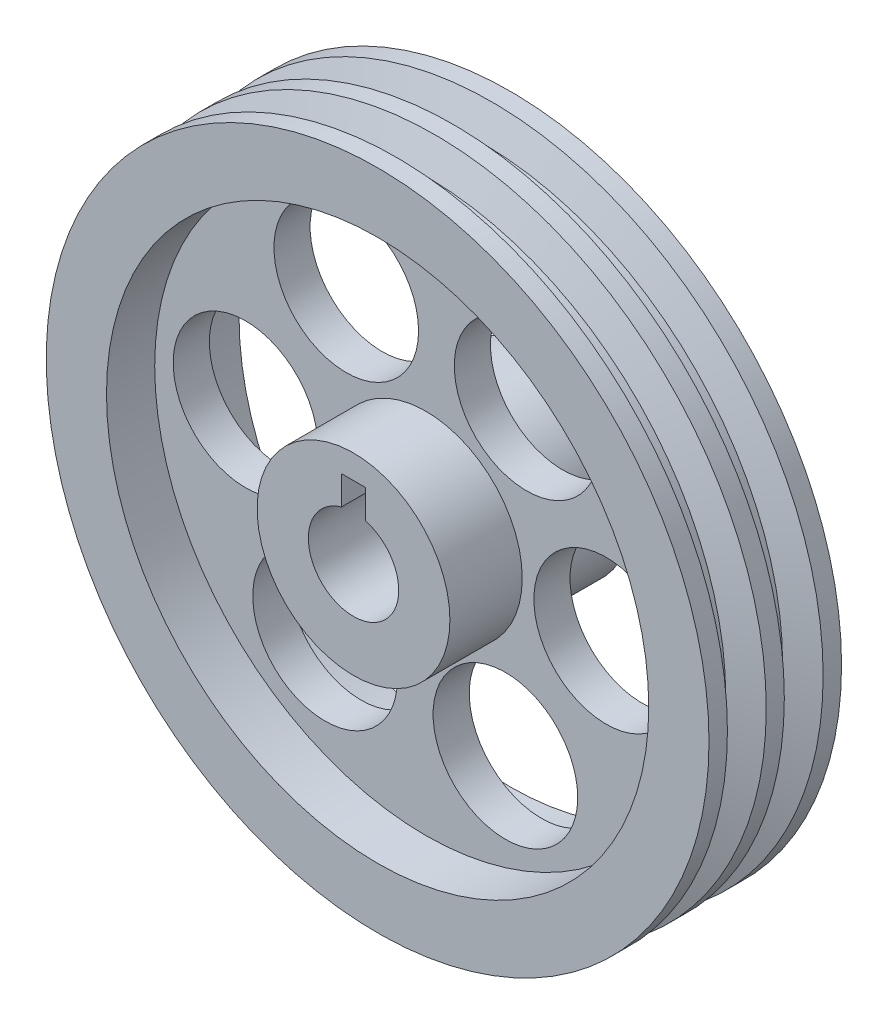
ISO-10303-21;
HEADER;
FILE_DESCRIPTION(('STEP AP214'),'2;1');
FILE_NAME('part.step','',(''),(''),'','','');
FILE_SCHEMA(('AUTOMOTIVE_DESIGN { 1 0 10303 214 1 1 1 1 }'));
ENDSEC;
DATA;
#1=APPLICATION_CONTEXT('core data for automotive mechanical design processes');
#2=APPLICATION_PROTOCOL_DEFINITION('international standard','automotive_design',2000,#1);
#3=PRODUCT_CONTEXT('',#1,'mechanical');
#4=PRODUCT('Part','Part','',(#3));
#5=PRODUCT_RELATED_PRODUCT_CATEGORY('part','',(#4));
#6=PRODUCT_DEFINITION_FORMATION('','',#4);
#7=PRODUCT_DEFINITION_CONTEXT('part definition',#1,'design');
#8=PRODUCT_DEFINITION('design','',#6,#7);
#9=PRODUCT_DEFINITION_SHAPE('','',#8);
#10=(LENGTH_UNIT() NAMED_UNIT(*) SI_UNIT(.MILLI.,.METRE.));
#11=(NAMED_UNIT(*) PLANE_ANGLE_UNIT() SI_UNIT($,.RADIAN.));
#12=(NAMED_UNIT(*) SI_UNIT($,.STERADIAN.) SOLID_ANGLE_UNIT());
#13=UNCERTAINTY_MEASURE_WITH_UNIT(LENGTH_MEASURE(1.E-05),#10,'distance_accuracy_value','');
#14=(GEOMETRIC_REPRESENTATION_CONTEXT(3) GLOBAL_UNCERTAINTY_ASSIGNED_CONTEXT((#13)) GLOBAL_UNIT_ASSIGNED_CONTEXT((#10,
#11,#12)) REPRESENTATION_CONTEXT('',''));
#15=CARTESIAN_POINT('',(0.,0.,0.));
#16=DIRECTION('',(0.,0.,1.));
#17=DIRECTION('',(1.,0.,0.));
#18=AXIS2_PLACEMENT_3D('',#15,#16,#17);
#19=CARTESIAN_POINT('',(0.,0.,11.));
#20=DIRECTION('',(0.,0.,-1.));
#21=DIRECTION('',(-1.,0.,0.));
#22=AXIS2_PLACEMENT_3D('',#19,#20,#21);
#23=CYLINDRICAL_SURFACE('',#22,55.);
#24=CARTESIAN_POINT('',(0.,0.,11.));
#25=DIRECTION('',(0.,0.,1.));
#26=DIRECTION('',(1.,0.,0.));
#27=AXIS2_PLACEMENT_3D('',#24,#25,#26);
#28=CIRCLE('',#27,55.);
#29=CARTESIAN_POINT('',(55.,0.,11.));
#30=VERTEX_POINT('',#29);
#31=EDGE_CURVE('E178',#30,#30,#28,.T.);
#32=ORIENTED_EDGE('',*,*,#31,.F.);
#33=EDGE_LOOP('',(#32));
#34=FACE_BOUND('',#33,.T.);
#35=CARTESIAN_POINT('',(0.,0.,7.94327613289666));
#36=DIRECTION('',(0.,0.,1.));
#37=DIRECTION('',(1.,0.,0.));
#38=AXIS2_PLACEMENT_3D('',#35,#36,#37);
#39=CIRCLE('',#38,55.);
#40=CARTESIAN_POINT('',(55.,0.,7.94327613289666));
#41=VERTEX_POINT('',#40);
#42=EDGE_CURVE('E186',#41,#41,#39,.T.);
#43=ORIENTED_EDGE('',*,*,#42,.T.);
#44=EDGE_LOOP('',(#43));
#45=FACE_BOUND('',#44,.T.);
#46=ADVANCED_FACE('F45',(#34,#45),#23,.T.);
#47=CARTESIAN_POINT('',(0.,0.,15.));
#48=DIRECTION('',(0.,0.,-1.));
#49=DIRECTION('',(-1.,0.,0.));
#50=AXIS2_PLACEMENT_3D('',#47,#48,#49);
#51=CYLINDRICAL_SURFACE('',#50,16.);
#52=CARTESIAN_POINT('',(0.,0.,-15.));
#53=DIRECTION('',(0.,0.,1.));
#54=DIRECTION('',(1.,0.,0.));
#55=AXIS2_PLACEMENT_3D('',#52,#53,#54);
#56=CIRCLE('',#55,16.);
#57=CARTESIAN_POINT('',(16.,0.,-15.));
#58=VERTEX_POINT('',#57);
#59=EDGE_CURVE('E125',#58,#58,#56,.T.);
#60=ORIENTED_EDGE('',*,*,#59,.T.);
#61=EDGE_LOOP('',(#60));
#62=FACE_BOUND('',#61,.T.);
#63=CARTESIAN_POINT('',(0.,0.,-3.));
#64=DIRECTION('',(0.,0.,1.));
#65=DIRECTION('',(1.,0.,0.));
#66=AXIS2_PLACEMENT_3D('',#63,#64,#65);
#67=CIRCLE('',#66,16.);
#68=CARTESIAN_POINT('',(16.,0.,-3.));
#69=VERTEX_POINT('',#68);
#70=EDGE_CURVE('E11',#69,#69,#67,.T.);
#71=ORIENTED_EDGE('',*,*,#70,.F.);
#72=EDGE_LOOP('',(#71));
#73=FACE_BOUND('',#72,.T.);
#74=ADVANCED_FACE('F244',(#62,#73),#51,.T.);
#75=CARTESIAN_POINT('',(0.,0.,15.));
#76=DIRECTION('',(0.,0.,-1.));
#77=DIRECTION('',(-1.,0.,0.));
#78=AXIS2_PLACEMENT_3D('',#75,#76,#77);
#79=CYLINDRICAL_SURFACE('',#78,7.5);
#80=CARTESIAN_POINT('',(0.,0.,-15.));
#81=DIRECTION('',(0.,0.,1.));
#82=DIRECTION('',(1.,0.,0.));
#83=AXIS2_PLACEMENT_3D('',#80,#81,#82);
#84=CIRCLE('',#83,7.5);
#85=CARTESIAN_POINT('',(-2.,7.22841614740048,-15.));
#86=VERTEX_POINT('',#85);
#87=CARTESIAN_POINT('',(2.,7.22841614740048,-15.));
#88=VERTEX_POINT('',#87);
#89=EDGE_CURVE('E116',#86,#88,#84,.T.);
#90=ORIENTED_EDGE('',*,*,#89,.F.);
#91=DIRECTION('',(0.,0.,-1.));
#92=VECTOR('',#91,1.);
#93=CARTESIAN_POINT('',(-2.,7.22841614740048,15.));
#94=LINE('',#93,#92);
#95=CARTESIAN_POINT('',(-2.,7.22841614740048,15.));
#96=VERTEX_POINT('',#95);
#97=EDGE_CURVE('E54',#96,#86,#94,.T.);
#98=ORIENTED_EDGE('',*,*,#97,.F.);
#99=CARTESIAN_POINT('',(0.,0.,15.));
#100=DIRECTION('',(0.,0.,1.));
#101=DIRECTION('',(1.,0.,0.));
#102=AXIS2_PLACEMENT_3D('',#99,#100,#101);
#103=CIRCLE('',#102,7.5);
#104=CARTESIAN_POINT('',(2.,7.22841614740048,15.));
#105=VERTEX_POINT('',#104);
#106=EDGE_CURVE('E106',#96,#105,#103,.T.);
#107=ORIENTED_EDGE('',*,*,#106,.T.);
#108=DIRECTION('',(0.,0.,-1.));
#109=VECTOR('',#108,1.);
#110=CARTESIAN_POINT('',(2.,7.22841614740048,15.));
#111=LINE('',#110,#109);
#112=EDGE_CURVE('E85',#105,#88,#111,.T.);
#113=ORIENTED_EDGE('',*,*,#112,.T.);
#114=EDGE_LOOP('',(#90,#98,#107,#113));
#115=FACE_BOUND('',#114,.T.);
#116=ADVANCED_FACE('F47',(#115),#79,.F.);
#117=CARTESIAN_POINT('',(-2.,0.,15.));
#118=DIRECTION('',(1.,0.,0.));
#119=DIRECTION('',(0.,0.,-1.));
#120=AXIS2_PLACEMENT_3D('',#117,#118,#119);
#121=PLANE('',#120);
#122=DIRECTION('',(0.,-1.,0.));
#123=VECTOR('',#122,1.);
#124=CARTESIAN_POINT('',(-2.,0.,-15.));
#125=LINE('',#124,#123);
#126=CARTESIAN_POINT('',(-2.,12.0229167109817,-15.));
#127=VERTEX_POINT('',#126);
#128=EDGE_CURVE('E97',#127,#86,#125,.T.);
#129=ORIENTED_EDGE('',*,*,#128,.F.);
#130=DIRECTION('',(0.,0.,-1.));
#131=VECTOR('',#130,1.);
#132=CARTESIAN_POINT('',(-2.,12.0229167109817,15.));
#133=LINE('',#132,#131);
#134=CARTESIAN_POINT('',(-2.,12.0229167109817,15.));
#135=VERTEX_POINT('',#134);
#136=EDGE_CURVE('E92',#135,#127,#133,.T.);
#137=ORIENTED_EDGE('',*,*,#136,.F.);
#138=DIRECTION('',(0.,-1.,0.));
#139=VECTOR('',#138,1.);
#140=CARTESIAN_POINT('',(-2.,0.,15.));
#141=LINE('',#140,#139);
#142=EDGE_CURVE('E95',#135,#96,#141,.T.);
#143=ORIENTED_EDGE('',*,*,#142,.T.);
#144=ORIENTED_EDGE('',*,*,#97,.T.);
#145=EDGE_LOOP('',(#129,#137,#143,#144));
#146=FACE_BOUND('',#145,.T.);
#147=ADVANCED_FACE('F94',(#146),#121,.T.);
#148=CARTESIAN_POINT('',(0.,12.0229167109817,15.));
#149=DIRECTION('',(0.,-1.,0.));
#150=DIRECTION('',(0.,0.,-1.));
#151=AXIS2_PLACEMENT_3D('',#148,#149,#150);
#152=PLANE('',#151);
#153=DIRECTION('',(-1.,0.,0.));
#154=VECTOR('',#153,1.);
#155=CARTESIAN_POINT('',(0.,12.0229167109817,-15.));
#156=LINE('',#155,#154);
#157=CARTESIAN_POINT('',(2.,12.0229167109817,-15.));
#158=VERTEX_POINT('',#157);
#159=EDGE_CURVE('E121',#158,#127,#156,.T.);
#160=ORIENTED_EDGE('',*,*,#159,.F.);
#161=DIRECTION('',(0.,0.,-1.));
#162=VECTOR('',#161,1.);
#163=CARTESIAN_POINT('',(2.,12.0229167109817,15.));
#164=LINE('',#163,#162);
#165=CARTESIAN_POINT('',(2.,12.0229167109817,15.));
#166=VERTEX_POINT('',#165);
#167=EDGE_CURVE('E78',#166,#158,#164,.T.);
#168=ORIENTED_EDGE('',*,*,#167,.F.);
#169=DIRECTION('',(-1.,0.,0.));
#170=VECTOR('',#169,1.);
#171=CARTESIAN_POINT('',(0.,12.0229167109817,15.));
#172=LINE('',#171,#170);
#173=EDGE_CURVE('E105',#166,#135,#172,.T.);
#174=ORIENTED_EDGE('',*,*,#173,.T.);
#175=ORIENTED_EDGE('',*,*,#136,.T.);
#176=EDGE_LOOP('',(#160,#168,#174,#175));
#177=FACE_BOUND('',#176,.T.);
#178=ADVANCED_FACE('F108',(#177),#152,.T.);
#179=CARTESIAN_POINT('',(2.,0.,15.));
#180=DIRECTION('',(1.,0.,0.));
#181=DIRECTION('',(0.,0.,-1.));
#182=AXIS2_PLACEMENT_3D('',#179,#180,#181);
#183=PLANE('',#182);
#184=DIRECTION('',(0.,-1.,0.));
#185=VECTOR('',#184,1.);
#186=CARTESIAN_POINT('',(2.,0.,-15.));
#187=LINE('',#186,#185);
#188=EDGE_CURVE('E123',#158,#88,#187,.T.);
#189=ORIENTED_EDGE('',*,*,#188,.T.);
#190=ORIENTED_EDGE('',*,*,#112,.F.);
#191=DIRECTION('',(0.,-1.,0.));
#192=VECTOR('',#191,1.);
#193=CARTESIAN_POINT('',(2.,0.,15.));
#194=LINE('',#193,#192);
#195=EDGE_CURVE('E62',#166,#105,#194,.T.);
#196=ORIENTED_EDGE('',*,*,#195,.F.);
#197=ORIENTED_EDGE('',*,*,#167,.T.);
#198=EDGE_LOOP('',(#189,#190,#196,#197));
#199=FACE_BOUND('',#198,.T.);
#200=ADVANCED_FACE('F132',(#199),#183,.F.);
#201=CARTESIAN_POINT('',(0.,0.,3.));
#202=DIRECTION('',(0.,0.,1.));
#203=DIRECTION('',(1.,0.,0.));
#204=AXIS2_PLACEMENT_3D('',#201,#202,#203);
#205=CIRCLE('',#204,16.);
#206=CARTESIAN_POINT('',(16.,0.,3.));
#207=VERTEX_POINT('',#206);
#208=EDGE_CURVE('E137',#207,#207,#205,.T.);
#209=ORIENTED_EDGE('',*,*,#208,.T.);
#210=EDGE_LOOP('',(#209));
#211=FACE_BOUND('',#210,.T.);
#212=CARTESIAN_POINT('',(0.,0.,15.));
#213=DIRECTION('',(0.,0.,1.));
#214=DIRECTION('',(1.,0.,0.));
#215=AXIS2_PLACEMENT_3D('',#212,#213,#214);
#216=CIRCLE('',#215,16.);
#217=CARTESIAN_POINT('',(16.,0.,15.));
#218=VERTEX_POINT('',#217);
#219=EDGE_CURVE('E110',#218,#218,#216,.T.);
#220=ORIENTED_EDGE('',*,*,#219,.F.);
#221=EDGE_LOOP('',(#220));
#222=FACE_BOUND('',#221,.T.);
#223=ADVANCED_FACE('F251',(#211,#222),#51,.T.);
#224=CARTESIAN_POINT('',(0.,0.,15.));
#225=DIRECTION('',(0.,0.,1.));
#226=DIRECTION('',(1.,0.,0.));
#227=AXIS2_PLACEMENT_3D('',#224,#225,#226);
#228=PLANE('',#227);
#229=ORIENTED_EDGE('',*,*,#106,.F.);
#230=ORIENTED_EDGE('',*,*,#142,.F.);
#231=ORIENTED_EDGE('',*,*,#173,.F.);
#232=ORIENTED_EDGE('',*,*,#195,.T.);
#233=EDGE_LOOP('',(#229,#230,#231,#232));
#234=FACE_BOUND('',#233,.T.);
#235=ORIENTED_EDGE('',*,*,#219,.T.);
#236=EDGE_LOOP('',(#235));
#237=FACE_BOUND('',#236,.T.);
#238=ADVANCED_FACE('F103',(#234,#237),#228,.T.);
#239=CARTESIAN_POINT('',(0.,0.,-15.));
#240=DIRECTION('',(0.,0.,1.));
#241=DIRECTION('',(1.,0.,0.));
#242=AXIS2_PLACEMENT_3D('',#239,#240,#241);
#243=PLANE('',#242);
#244=ORIENTED_EDGE('',*,*,#89,.T.);
#245=ORIENTED_EDGE('',*,*,#188,.F.);
#246=ORIENTED_EDGE('',*,*,#159,.T.);
#247=ORIENTED_EDGE('',*,*,#128,.T.);
#248=EDGE_LOOP('',(#244,#245,#246,#247));
#249=FACE_BOUND('',#248,.T.);
#250=ORIENTED_EDGE('',*,*,#59,.F.);
#251=EDGE_LOOP('',(#250));
#252=FACE_BOUND('',#251,.T.);
#253=ADVANCED_FACE('F130',(#249,#252),#243,.F.);
#254=CARTESIAN_POINT('',(-13.2074533591109,26.9362799169988,3.));
#255=DIRECTION('',(0.,0.,-1.));
#256=DIRECTION('',(-1.,0.,0.));
#257=AXIS2_PLACEMENT_3D('',#254,#255,#256);
#258=CYLINDRICAL_SURFACE('',#257,12.);
#259=CARTESIAN_POINT('',(-13.2074533591109,26.9362799169988,3.));
#260=DIRECTION('',(0.,0.,1.));
#261=DIRECTION('',(1.,0.,0.));
#262=AXIS2_PLACEMENT_3D('',#259,#260,#261);
#263=CIRCLE('',#262,12.);
#264=CARTESIAN_POINT('',(-1.20745335911087,26.9362799169988,3.));
#265=VERTEX_POINT('',#264);
#266=EDGE_CURVE('E119',#265,#265,#263,.T.);
#267=ORIENTED_EDGE('',*,*,#266,.T.);
#268=EDGE_LOOP('',(#267));
#269=FACE_BOUND('',#268,.T.);
#270=CARTESIAN_POINT('',(-13.2074533591109,26.9362799169988,-3.));
#271=DIRECTION('',(0.,0.,1.));
#272=DIRECTION('',(1.,0.,0.));
#273=AXIS2_PLACEMENT_3D('',#270,#271,#272);
#274=CIRCLE('',#273,12.);
#275=CARTESIAN_POINT('',(-1.20745335911087,26.9362799169988,-3.));
#276=VERTEX_POINT('',#275);
#277=EDGE_CURVE('E138',#276,#276,#274,.T.);
#278=ORIENTED_EDGE('',*,*,#277,.F.);
#279=EDGE_LOOP('',(#278));
#280=FACE_BOUND('',#279,.T.);
#281=ADVANCED_FACE('F429',(#269,#280),#258,.F.);
#282=CARTESIAN_POINT('',(-29.931229371125,2.03014983021119,3.));
#283=DIRECTION('',(0.,0.,-1.));
#284=DIRECTION('',(-1.,0.,0.));
#285=AXIS2_PLACEMENT_3D('',#282,#283,#284);
#286=CYLINDRICAL_SURFACE('',#285,12.);
#287=CARTESIAN_POINT('',(-29.931229371125,2.03014983021119,3.));
#288=DIRECTION('',(0.,0.,1.));
#289=DIRECTION('',(1.,0.,0.));
#290=AXIS2_PLACEMENT_3D('',#287,#288,#289);
#291=CIRCLE('',#290,12.);
#292=CARTESIAN_POINT('',(-17.9312293711249,2.03014983021119,3.));
#293=VERTEX_POINT('',#292);
#294=EDGE_CURVE('E159',#293,#293,#291,.T.);
#295=ORIENTED_EDGE('',*,*,#294,.T.);
#296=EDGE_LOOP('',(#295));
#297=FACE_BOUND('',#296,.T.);
#298=CARTESIAN_POINT('',(-29.931229371125,2.03014983021119,-3.));
#299=DIRECTION('',(0.,0.,1.));
#300=DIRECTION('',(1.,0.,0.));
#301=AXIS2_PLACEMENT_3D('',#298,#299,#300);
#302=CIRCLE('',#301,12.);
#303=CARTESIAN_POINT('',(-17.9312293711249,2.03014983021119,-3.));
#304=VERTEX_POINT('',#303);
#305=EDGE_CURVE('E141',#304,#304,#302,.T.);
#306=ORIENTED_EDGE('',*,*,#305,.F.);
#307=EDGE_LOOP('',(#306));
#308=FACE_BOUND('',#307,.T.);
#309=ADVANCED_FACE('F419',(#297,#308),#286,.F.);
#310=CARTESIAN_POINT('',(-16.723776012014,-24.9061300867876,3.));
#311=DIRECTION('',(0.,0.,-1.));
#312=DIRECTION('',(-1.,0.,0.));
#313=AXIS2_PLACEMENT_3D('',#310,#311,#312);
#314=CYLINDRICAL_SURFACE('',#313,12.);
#315=CARTESIAN_POINT('',(-16.723776012014,-24.9061300867876,3.));
#316=DIRECTION('',(0.,0.,1.));
#317=DIRECTION('',(1.,0.,0.));
#318=AXIS2_PLACEMENT_3D('',#315,#316,#317);
#319=CIRCLE('',#318,12.);
#320=CARTESIAN_POINT('',(-4.72377601201397,-24.9061300867876,3.));
#321=VERTEX_POINT('',#320);
#322=EDGE_CURVE('E162',#321,#321,#319,.T.);
#323=ORIENTED_EDGE('',*,*,#322,.T.);
#324=EDGE_LOOP('',(#323));
#325=FACE_BOUND('',#324,.T.);
#326=CARTESIAN_POINT('',(-16.723776012014,-24.9061300867876,-3.));
#327=DIRECTION('',(0.,0.,1.));
#328=DIRECTION('',(1.,0.,0.));
#329=AXIS2_PLACEMENT_3D('',#326,#327,#328);
#330=CIRCLE('',#329,12.);
#331=CARTESIAN_POINT('',(-4.72377601201397,-24.9061300867876,-3.));
#332=VERTEX_POINT('',#331);
#333=EDGE_CURVE('E144',#332,#332,#330,.T.);
#334=ORIENTED_EDGE('',*,*,#333,.F.);
#335=EDGE_LOOP('',(#334));
#336=FACE_BOUND('',#335,.T.);
#337=ADVANCED_FACE('F409',(#325,#336),#314,.F.);
#338=CARTESIAN_POINT('',(13.2074533591111,-26.9362799169987,3.));
#339=DIRECTION('',(0.,0.,-1.));
#340=DIRECTION('',(-1.,0.,0.));
#341=AXIS2_PLACEMENT_3D('',#338,#339,#340);
#342=CYLINDRICAL_SURFACE('',#341,12.);
#343=CARTESIAN_POINT('',(13.2074533591111,-26.9362799169987,3.));
#344=DIRECTION('',(0.,0.,1.));
#345=DIRECTION('',(1.,0.,0.));
#346=AXIS2_PLACEMENT_3D('',#343,#344,#345);
#347=CIRCLE('',#346,12.);
#348=CARTESIAN_POINT('',(25.2074533591111,-26.9362799169987,3.));
#349=VERTEX_POINT('',#348);
#350=EDGE_CURVE('E165',#349,#349,#347,.T.);
#351=ORIENTED_EDGE('',*,*,#350,.T.);
#352=EDGE_LOOP('',(#351));
#353=FACE_BOUND('',#352,.T.);
#354=CARTESIAN_POINT('',(13.2074533591111,-26.9362799169987,-3.));
#355=DIRECTION('',(0.,0.,1.));
#356=DIRECTION('',(1.,0.,0.));
#357=AXIS2_PLACEMENT_3D('',#354,#355,#356);
#358=CIRCLE('',#357,12.);
#359=CARTESIAN_POINT('',(25.2074533591111,-26.9362799169987,-3.));
#360=VERTEX_POINT('',#359);
#361=EDGE_CURVE('E147',#360,#360,#358,.T.);
#362=ORIENTED_EDGE('',*,*,#361,.F.);
#363=EDGE_LOOP('',(#362));
#364=FACE_BOUND('',#363,.T.);
#365=ADVANCED_FACE('F399',(#353,#364),#342,.F.);
#366=CARTESIAN_POINT('',(29.931229371125,-2.03014983021098,3.));
#367=DIRECTION('',(0.,0.,-1.));
#368=DIRECTION('',(-1.,0.,0.));
#369=AXIS2_PLACEMENT_3D('',#366,#367,#368);
#370=CYLINDRICAL_SURFACE('',#369,12.);
#371=CARTESIAN_POINT('',(29.931229371125,-2.03014983021098,3.));
#372=DIRECTION('',(0.,0.,1.));
#373=DIRECTION('',(1.,0.,0.));
#374=AXIS2_PLACEMENT_3D('',#371,#372,#373);
#375=CIRCLE('',#374,12.);
#376=CARTESIAN_POINT('',(41.931229371125,-2.03014983021098,3.));
#377=VERTEX_POINT('',#376);
#378=EDGE_CURVE('E168',#377,#377,#375,.T.);
#379=ORIENTED_EDGE('',*,*,#378,.T.);
#380=EDGE_LOOP('',(#379));
#381=FACE_BOUND('',#380,.T.);
#382=CARTESIAN_POINT('',(29.931229371125,-2.03014983021098,-3.));
#383=DIRECTION('',(0.,0.,1.));
#384=DIRECTION('',(1.,0.,0.));
#385=AXIS2_PLACEMENT_3D('',#382,#383,#384);
#386=CIRCLE('',#385,12.);
#387=CARTESIAN_POINT('',(41.931229371125,-2.03014983021098,-3.));
#388=VERTEX_POINT('',#387);
#389=EDGE_CURVE('E150',#388,#388,#386,.T.);
#390=ORIENTED_EDGE('',*,*,#389,.F.);
#391=EDGE_LOOP('',(#390));
#392=FACE_BOUND('',#391,.T.);
#393=ADVANCED_FACE('F389',(#381,#392),#370,.F.);
#394=CARTESIAN_POINT('',(16.7237760120138,24.9061300867877,3.));
#395=DIRECTION('',(0.,0.,-1.));
#396=DIRECTION('',(-1.,0.,0.));
#397=AXIS2_PLACEMENT_3D('',#394,#395,#396);
#398=CYLINDRICAL_SURFACE('',#397,12.);
#399=CARTESIAN_POINT('',(16.7237760120138,24.9061300867877,3.));
#400=DIRECTION('',(0.,0.,1.));
#401=DIRECTION('',(1.,0.,0.));
#402=AXIS2_PLACEMENT_3D('',#399,#400,#401);
#403=CIRCLE('',#402,12.);
#404=CARTESIAN_POINT('',(28.7237760120138,24.9061300867877,3.));
#405=VERTEX_POINT('',#404);
#406=EDGE_CURVE('E171',#405,#405,#403,.T.);
#407=ORIENTED_EDGE('',*,*,#406,.T.);
#408=EDGE_LOOP('',(#407));
#409=FACE_BOUND('',#408,.T.);
#410=CARTESIAN_POINT('',(16.7237760120138,24.9061300867877,-3.));
#411=DIRECTION('',(0.,0.,1.));
#412=DIRECTION('',(1.,0.,0.));
#413=AXIS2_PLACEMENT_3D('',#410,#411,#412);
#414=CIRCLE('',#413,12.);
#415=CARTESIAN_POINT('',(28.7237760120138,24.9061300867877,-3.));
#416=VERTEX_POINT('',#415);
#417=EDGE_CURVE('E153',#416,#416,#414,.T.);
#418=ORIENTED_EDGE('',*,*,#417,.F.);
#419=EDGE_LOOP('',(#418));
#420=FACE_BOUND('',#419,.T.);
#421=ADVANCED_FACE('F379',(#409,#420),#398,.F.);
#422=CARTESIAN_POINT('',(0.,0.,3.));
#423=DIRECTION('',(0.,0.,1.));
#424=DIRECTION('',(1.,0.,0.));
#425=AXIS2_PLACEMENT_3D('',#422,#423,#424);
#426=PLANE('',#425);
#427=ORIENTED_EDGE('',*,*,#208,.F.);
#428=EDGE_LOOP('',(#427));
#429=FACE_BOUND('',#428,.T.);
#430=ORIENTED_EDGE('',*,*,#406,.F.);
#431=EDGE_LOOP('',(#430));
#432=FACE_BOUND('',#431,.T.);
#433=ORIENTED_EDGE('',*,*,#378,.F.);
#434=EDGE_LOOP('',(#433));
#435=FACE_BOUND('',#434,.T.);
#436=ORIENTED_EDGE('',*,*,#350,.F.);
#437=EDGE_LOOP('',(#436));
#438=FACE_BOUND('',#437,.T.);
#439=ORIENTED_EDGE('',*,*,#322,.F.);
#440=EDGE_LOOP('',(#439));
#441=FACE_BOUND('',#440,.T.);
#442=ORIENTED_EDGE('',*,*,#294,.F.);
#443=EDGE_LOOP('',(#442));
#444=FACE_BOUND('',#443,.T.);
#445=ORIENTED_EDGE('',*,*,#266,.F.);
#446=EDGE_LOOP('',(#445));
#447=FACE_BOUND('',#446,.T.);
#448=CARTESIAN_POINT('',(0.,0.,3.));
#449=DIRECTION('',(0.,0.,1.));
#450=DIRECTION('',(1.,0.,0.));
#451=AXIS2_PLACEMENT_3D('',#448,#449,#450);
#452=CIRCLE('',#451,45.);
#453=CARTESIAN_POINT('',(45.,0.,3.));
#454=VERTEX_POINT('',#453);
#455=EDGE_CURVE('E156',#454,#454,#452,.F.);
#456=ORIENTED_EDGE('',*,*,#455,.F.);
#457=EDGE_LOOP('',(#456));
#458=FACE_BOUND('',#457,.T.);
#459=ADVANCED_FACE('F369',(#429,#432,#435,#438,#441,#444,#447,#458),#426,.T.);
#460=CARTESIAN_POINT('',(0.,0.,-3.));
#461=DIRECTION('',(0.,0.,1.));
#462=DIRECTION('',(1.,0.,0.));
#463=AXIS2_PLACEMENT_3D('',#460,#461,#462);
#464=PLANE('',#463);
#465=ORIENTED_EDGE('',*,*,#70,.T.);
#466=EDGE_LOOP('',(#465));
#467=FACE_BOUND('',#466,.T.);
#468=ORIENTED_EDGE('',*,*,#417,.T.);
#469=EDGE_LOOP('',(#468));
#470=FACE_BOUND('',#469,.T.);
#471=ORIENTED_EDGE('',*,*,#389,.T.);
#472=EDGE_LOOP('',(#471));
#473=FACE_BOUND('',#472,.T.);
#474=ORIENTED_EDGE('',*,*,#361,.T.);
#475=EDGE_LOOP('',(#474));
#476=FACE_BOUND('',#475,.T.);
#477=ORIENTED_EDGE('',*,*,#333,.T.);
#478=EDGE_LOOP('',(#477));
#479=FACE_BOUND('',#478,.T.);
#480=ORIENTED_EDGE('',*,*,#305,.T.);
#481=EDGE_LOOP('',(#480));
#482=FACE_BOUND('',#481,.T.);
#483=ORIENTED_EDGE('',*,*,#277,.T.);
#484=EDGE_LOOP('',(#483));
#485=FACE_BOUND('',#484,.T.);
#486=CARTESIAN_POINT('',(0.,0.,-3.));
#487=DIRECTION('',(0.,0.,1.));
#488=DIRECTION('',(1.,0.,0.));
#489=AXIS2_PLACEMENT_3D('',#486,#487,#488);
#490=CIRCLE('',#489,45.);
#491=CARTESIAN_POINT('',(45.,0.,-3.));
#492=VERTEX_POINT('',#491);
#493=EDGE_CURVE('E134',#492,#492,#490,.T.);
#494=ORIENTED_EDGE('',*,*,#493,.F.);
#495=EDGE_LOOP('',(#494));
#496=FACE_BOUND('',#495,.T.);
#497=ADVANCED_FACE('F360',(#467,#470,#473,#476,#479,#482,#485,#496),#464,.F.);
#498=CARTESIAN_POINT('',(0.,0.,11.));
#499=DIRECTION('',(0.,0.,-1.));
#500=DIRECTION('',(-1.,0.,0.));
#501=AXIS2_PLACEMENT_3D('',#498,#499,#500);
#502=CYLINDRICAL_SURFACE('',#501,45.);
#503=CARTESIAN_POINT('',(0.,0.,-11.));
#504=DIRECTION('',(0.,0.,1.));
#505=DIRECTION('',(1.,0.,0.));
#506=AXIS2_PLACEMENT_3D('',#503,#504,#505);
#507=CIRCLE('',#506,45.);
#508=CARTESIAN_POINT('',(45.,0.,-11.));
#509=VERTEX_POINT('',#508);
#510=EDGE_CURVE('E183',#509,#509,#507,.T.);
#511=ORIENTED_EDGE('',*,*,#510,.F.);
#512=EDGE_LOOP('',(#511));
#513=FACE_BOUND('',#512,.T.);
#514=ORIENTED_EDGE('',*,*,#493,.T.);
#515=EDGE_LOOP('',(#514));
#516=FACE_BOUND('',#515,.T.);
#517=ADVANCED_FACE('F262',(#513,#516),#502,.F.);
#518=ORIENTED_EDGE('',*,*,#455,.T.);
#519=EDGE_LOOP('',(#518));
#520=FACE_BOUND('',#519,.T.);
#521=CARTESIAN_POINT('',(0.,0.,11.));
#522=DIRECTION('',(0.,0.,1.));
#523=DIRECTION('',(1.,0.,0.));
#524=AXIS2_PLACEMENT_3D('',#521,#522,#523);
#525=CIRCLE('',#524,45.);
#526=CARTESIAN_POINT('',(45.,0.,11.));
#527=VERTEX_POINT('',#526);
#528=EDGE_CURVE('E182',#527,#527,#525,.T.);
#529=ORIENTED_EDGE('',*,*,#528,.T.);
#530=EDGE_LOOP('',(#529));
#531=FACE_BOUND('',#530,.T.);
#532=ADVANCED_FACE('F255',(#520,#531),#502,.F.);
#533=CARTESIAN_POINT('',(0.,0.,-7.94327613289666));
#534=DIRECTION('',(0.,0.,1.));
#535=DIRECTION('',(1.,0.,0.));
#536=AXIS2_PLACEMENT_3D('',#533,#534,#535);
#537=CIRCLE('',#536,55.);
#538=CARTESIAN_POINT('',(55.,0.,-7.94327613289666));
#539=VERTEX_POINT('',#538);
#540=EDGE_CURVE('E201',#539,#539,#537,.T.);
#541=ORIENTED_EDGE('',*,*,#540,.F.);
#542=EDGE_LOOP('',(#541));
#543=FACE_BOUND('',#542,.T.);
#544=CARTESIAN_POINT('',(0.,0.,-11.));
#545=DIRECTION('',(0.,0.,1.));
#546=DIRECTION('',(1.,0.,0.));
#547=AXIS2_PLACEMENT_3D('',#544,#545,#546);
#548=CIRCLE('',#547,55.);
#549=CARTESIAN_POINT('',(55.,0.,-11.));
#550=VERTEX_POINT('',#549);
#551=EDGE_CURVE('E179',#550,#550,#548,.T.);
#552=ORIENTED_EDGE('',*,*,#551,.T.);
#553=EDGE_LOOP('',(#552));
#554=FACE_BOUND('',#553,.T.);
#555=ADVANCED_FACE('F223',(#543,#554),#23,.T.);
#556=CARTESIAN_POINT('',(0.,0.,11.));
#557=DIRECTION('',(0.,0.,1.));
#558=DIRECTION('',(1.,0.,0.));
#559=AXIS2_PLACEMENT_3D('',#556,#557,#558);
#560=PLANE('',#559);
#561=ORIENTED_EDGE('',*,*,#528,.F.);
#562=EDGE_LOOP('',(#561));
#563=FACE_BOUND('',#562,.T.);
#564=ORIENTED_EDGE('',*,*,#31,.T.);
#565=EDGE_LOOP('',(#564));
#566=FACE_BOUND('',#565,.T.);
#567=ADVANCED_FACE('F239',(#563,#566),#560,.T.);
#568=CARTESIAN_POINT('',(0.,0.,-11.));
#569=DIRECTION('',(0.,0.,1.));
#570=DIRECTION('',(1.,0.,0.));
#571=AXIS2_PLACEMENT_3D('',#568,#569,#570);
#572=PLANE('',#571);
#573=ORIENTED_EDGE('',*,*,#510,.T.);
#574=EDGE_LOOP('',(#573));
#575=FACE_BOUND('',#574,.T.);
#576=ORIENTED_EDGE('',*,*,#551,.F.);
#577=EDGE_LOOP('',(#576));
#578=FACE_BOUND('',#577,.T.);
#579=ADVANCED_FACE('F229',(#575,#578),#572,.F.);
#580=CARTESIAN_POINT('',(0.,0.,-1.5));
#581=DIRECTION('',(0.,0.,1.));
#582=DIRECTION('',(1.,0.,0.));
#583=AXIS2_PLACEMENT_3D('',#580,#581,#582);
#584=CONICAL_SURFACE('',#583,55.,1.23918376891597);
#585=CARTESIAN_POINT('',(0.,0.,-3.22163806644833));
#586=DIRECTION('',(0.,0.,1.));
#587=DIRECTION('',(1.,0.,0.));
#588=AXIS2_PLACEMENT_3D('',#585,#586,#587);
#589=CIRCLE('',#588,50.);
#590=CARTESIAN_POINT('',(50.,0.,-3.22163806644833));
#591=VERTEX_POINT('',#590);
#592=EDGE_CURVE('E195',#591,#591,#589,.T.);
#593=ORIENTED_EDGE('',*,*,#592,.T.);
#594=EDGE_LOOP('',(#593));
#595=FACE_BOUND('',#594,.T.);
#596=CARTESIAN_POINT('',(0.,0.,-1.5));
#597=DIRECTION('',(0.,0.,1.));
#598=DIRECTION('',(1.,0.,0.));
#599=AXIS2_PLACEMENT_3D('',#596,#597,#598);
#600=CIRCLE('',#599,55.);
#601=CARTESIAN_POINT('',(55.,0.,-1.5));
#602=VERTEX_POINT('',#601);
#603=EDGE_CURVE('E191',#602,#602,#600,.T.);
#604=ORIENTED_EDGE('',*,*,#603,.F.);
#605=EDGE_LOOP('',(#604));
#606=FACE_BOUND('',#605,.T.);
#607=ADVANCED_FACE('F226',(#595,#606),#584,.T.);
#608=CARTESIAN_POINT('',(0.,0.,17.5037486094112));
#609=DIRECTION('',(0.,0.,1.));
#610=DIRECTION('',(1.,0.,0.));
#611=AXIS2_PLACEMENT_3D('',#608,#609,#610);
#612=CYLINDRICAL_SURFACE('',#611,50.);
#613=ORIENTED_EDGE('',*,*,#592,.F.);
#614=EDGE_LOOP('',(#613));
#615=FACE_BOUND('',#614,.T.);
#616=CARTESIAN_POINT('',(0.,0.,-6.22163806644833));
#617=DIRECTION('',(0.,0.,1.));
#618=DIRECTION('',(1.,0.,0.));
#619=AXIS2_PLACEMENT_3D('',#616,#617,#618);
#620=CIRCLE('',#619,50.);
#621=CARTESIAN_POINT('',(50.,0.,-6.22163806644833));
#622=VERTEX_POINT('',#621);
#623=EDGE_CURVE('E198',#622,#622,#620,.T.);
#624=ORIENTED_EDGE('',*,*,#623,.T.);
#625=EDGE_LOOP('',(#624));
#626=FACE_BOUND('',#625,.T.);
#627=ADVANCED_FACE('F228',(#615,#626),#612,.T.);
#628=CARTESIAN_POINT('',(0.,0.,-7.94327613289666));
#629=DIRECTION('',(0.,0.,-1.));
#630=DIRECTION('',(-1.,0.,0.));
#631=AXIS2_PLACEMENT_3D('',#628,#629,#630);
#632=CONICAL_SURFACE('',#631,55.,1.23918376891597);
#633=ORIENTED_EDGE('',*,*,#623,.F.);
#634=EDGE_LOOP('',(#633));
#635=FACE_BOUND('',#634,.T.);
#636=ORIENTED_EDGE('',*,*,#540,.T.);
#637=EDGE_LOOP('',(#636));
#638=FACE_BOUND('',#637,.T.);
#639=ADVANCED_FACE('F221',(#635,#638),#632,.T.);
#640=CARTESIAN_POINT('',(0.,0.,1.5));
#641=DIRECTION('',(0.,0.,1.));
#642=DIRECTION('',(1.,0.,0.));
#643=AXIS2_PLACEMENT_3D('',#640,#641,#642);
#644=CIRCLE('',#643,55.);
#645=CARTESIAN_POINT('',(55.,0.,1.5));
#646=VERTEX_POINT('',#645);
#647=EDGE_CURVE('E194',#646,#646,#644,.T.);
#648=ORIENTED_EDGE('',*,*,#647,.F.);
#649=EDGE_LOOP('',(#648));
#650=FACE_BOUND('',#649,.T.);
#651=ORIENTED_EDGE('',*,*,#603,.T.);
#652=EDGE_LOOP('',(#651));
#653=FACE_BOUND('',#652,.T.);
#654=ADVANCED_FACE('F217',(#650,#653),#23,.T.);
#655=CARTESIAN_POINT('',(0.,0.,7.94327613289666));
#656=DIRECTION('',(0.,0.,1.));
#657=DIRECTION('',(1.,0.,0.));
#658=AXIS2_PLACEMENT_3D('',#655,#656,#657);
#659=CONICAL_SURFACE('',#658,55.,1.23918376891597);
#660=CARTESIAN_POINT('',(0.,0.,6.22163806644833));
#661=DIRECTION('',(0.,0.,1.));
#662=DIRECTION('',(1.,0.,0.));
#663=AXIS2_PLACEMENT_3D('',#660,#661,#662);
#664=CIRCLE('',#663,50.);
#665=CARTESIAN_POINT('',(50.,0.,6.22163806644833));
#666=VERTEX_POINT('',#665);
#667=EDGE_CURVE('E206',#666,#666,#664,.T.);
#668=ORIENTED_EDGE('',*,*,#667,.T.);
#669=EDGE_LOOP('',(#668));
#670=FACE_BOUND('',#669,.T.);
#671=ORIENTED_EDGE('',*,*,#42,.F.);
#672=EDGE_LOOP('',(#671));
#673=FACE_BOUND('',#672,.T.);
#674=ADVANCED_FACE('F220',(#670,#673),#659,.T.);
#675=CARTESIAN_POINT('',(0.,0.,17.5037486094112));
#676=DIRECTION('',(0.,0.,1.));
#677=DIRECTION('',(1.,0.,0.));
#678=AXIS2_PLACEMENT_3D('',#675,#676,#677);
#679=CYLINDRICAL_SURFACE('',#678,50.);
#680=CARTESIAN_POINT('',(0.,0.,3.22163806644833));
#681=DIRECTION('',(0.,0.,1.));
#682=DIRECTION('',(1.,0.,0.));
#683=AXIS2_PLACEMENT_3D('',#680,#681,#682);
#684=CIRCLE('',#683,50.);
#685=CARTESIAN_POINT('',(50.,0.,3.22163806644833));
#686=VERTEX_POINT('',#685);
#687=EDGE_CURVE('E209',#686,#686,#684,.T.);
#688=ORIENTED_EDGE('',*,*,#687,.T.);
#689=EDGE_LOOP('',(#688));
#690=FACE_BOUND('',#689,.T.);
#691=ORIENTED_EDGE('',*,*,#667,.F.);
#692=EDGE_LOOP('',(#691));
#693=FACE_BOUND('',#692,.T.);
#694=ADVANCED_FACE('F278',(#690,#693),#679,.T.);
#695=CARTESIAN_POINT('',(0.,0.,1.5));
#696=DIRECTION('',(0.,0.,-1.));
#697=DIRECTION('',(-1.,0.,0.));
#698=AXIS2_PLACEMENT_3D('',#695,#696,#697);
#699=CONICAL_SURFACE('',#698,55.,1.23918376891597);
#700=ORIENTED_EDGE('',*,*,#687,.F.);
#701=EDGE_LOOP('',(#700));
#702=FACE_BOUND('',#701,.T.);
#703=ORIENTED_EDGE('',*,*,#647,.T.);
#704=EDGE_LOOP('',(#703));
#705=FACE_BOUND('',#704,.T.);
#706=ADVANCED_FACE('F215',(#702,#705),#699,.T.);
#707=CLOSED_SHELL('',(#46,#74,#116,#147,#178,#200,#223,#238,#253,#281,#309,#337,#365,#393,#421,
#459,#497,#517,#532,#555,#567,#579,#607,#627,#639,#654,#674,#694,#706));
#708=MANIFOLD_SOLID_BREP('B2',#707);
#709=ADVANCED_BREP_SHAPE_REPRESENTATION('',(#18,#708),#14);
#710=SHAPE_DEFINITION_REPRESENTATION(#9,#709);
ENDSEC;
END-ISO-10303-21;
